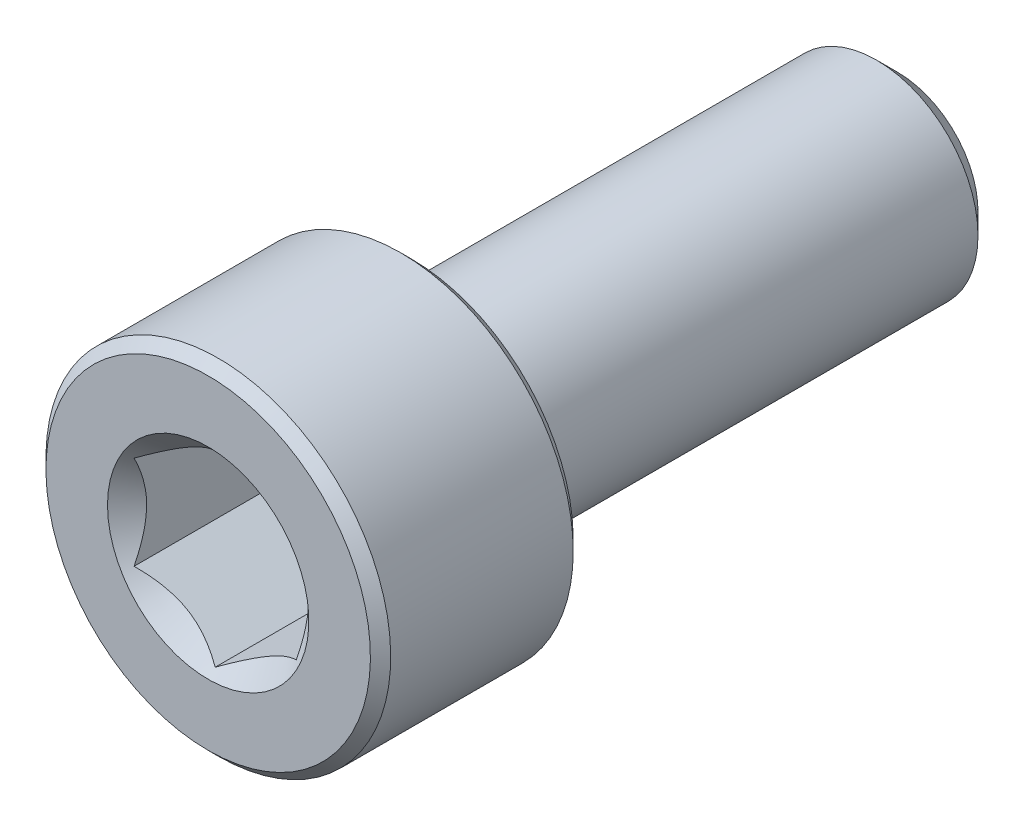
ISO-10303-21;
HEADER;
FILE_DESCRIPTION(('STEP AP214'),'2;1');
FILE_NAME('part.step','',(''),(''),'','','');
FILE_SCHEMA(('AUTOMOTIVE_DESIGN { 1 0 10303 214 1 1 1 1 }'));
ENDSEC;
DATA;
#1=APPLICATION_CONTEXT('core data for automotive mechanical design processes');
#2=APPLICATION_PROTOCOL_DEFINITION('international standard','automotive_design',2000,#1);
#3=PRODUCT_CONTEXT('',#1,'mechanical');
#4=PRODUCT('Part','Part','',(#3));
#5=PRODUCT_RELATED_PRODUCT_CATEGORY('part','',(#4));
#6=PRODUCT_DEFINITION_FORMATION('','',#4);
#7=PRODUCT_DEFINITION_CONTEXT('part definition',#1,'design');
#8=PRODUCT_DEFINITION('design','',#6,#7);
#9=PRODUCT_DEFINITION_SHAPE('','',#8);
#10=(LENGTH_UNIT() NAMED_UNIT(*) SI_UNIT(.MILLI.,.METRE.));
#11=(NAMED_UNIT(*) PLANE_ANGLE_UNIT() SI_UNIT($,.RADIAN.));
#12=(NAMED_UNIT(*) SI_UNIT($,.STERADIAN.) SOLID_ANGLE_UNIT());
#13=UNCERTAINTY_MEASURE_WITH_UNIT(LENGTH_MEASURE(1.E-05),#10,'distance_accuracy_value','');
#14=(GEOMETRIC_REPRESENTATION_CONTEXT(3) GLOBAL_UNCERTAINTY_ASSIGNED_CONTEXT((#13)) GLOBAL_UNIT_ASSIGNED_CONTEXT((#10,
#11,#12)) REPRESENTATION_CONTEXT('',''));
#15=CARTESIAN_POINT('',(0.,0.,0.));
#16=DIRECTION('',(0.,0.,1.));
#17=DIRECTION('',(1.,0.,0.));
#18=AXIS2_PLACEMENT_3D('',#15,#16,#17);
#19=CARTESIAN_POINT('',(2.,-1.15470053837925,-2.61010092660779));
#20=DIRECTION('',(1.,0.,0.));
#21=DIRECTION('',(0.,1.,0.));
#22=AXIS2_PLACEMENT_3D('',#19,#20,#21);
#23=PLANE('',#22);
#24=DIRECTION('',(0.,0.,1.));
#25=VECTOR('',#24,1.);
#26=CARTESIAN_POINT('',(2.,-1.15470053837925,-2.61010092660779));
#27=LINE('',#26,#25);
#28=CARTESIAN_POINT('',(2.,-1.15470053837925,4.5));
#29=VERTEX_POINT('',#28);
#30=CARTESIAN_POINT('',(2.,-1.15470053837925,8.32679491924311));
#31=VERTEX_POINT('',#30);
#32=EDGE_CURVE('E155',#29,#31,#27,.T.);
#33=ORIENTED_EDGE('',*,*,#32,.T.);
#34=CARTESIAN_POINT('',(2.,-1.15470053841184,8.32679491925941));
#35=CARTESIAN_POINT('',(2.,-1.2222112211191E-11,7.74944465004738));
#36=CARTESIAN_POINT('',(2.,1.15470053837925,8.3267949192431));
#37=(BOUNDED_CURVE() B_SPLINE_CURVE(2,(#34,#35,#36),.UNSPECIFIED.,.F.,
.F.) B_SPLINE_CURVE_WITH_KNOTS((3,3),(-0.486933326000508,-0.155769300936608),
.UNSPECIFIED.) CURVE() GEOMETRIC_REPRESENTATION_ITEM() RATIONAL_B_SPLINE_CURVE((1.27224318642874,
1.46905989232656,1.27224318643355)) REPRESENTATION_ITEM(''));
#38=CARTESIAN_POINT('',(2.,1.15470053837925,8.32679491924311));
#39=VERTEX_POINT('',#38);
#40=EDGE_CURVE('E120',#31,#39,#37,.T.);
#41=ORIENTED_EDGE('',*,*,#40,.T.);
#42=DIRECTION('',(0.,0.,1.));
#43=VECTOR('',#42,1.);
#44=CARTESIAN_POINT('',(2.,1.15470053837925,-2.61010092660779));
#45=LINE('',#44,#43);
#46=CARTESIAN_POINT('',(2.,1.15470053837925,4.5));
#47=VERTEX_POINT('',#46);
#48=EDGE_CURVE('E11',#47,#39,#45,.T.);
#49=ORIENTED_EDGE('',*,*,#48,.F.);
#50=DIRECTION('',(0.,1.,0.));
#51=VECTOR('',#50,1.);
#52=CARTESIAN_POINT('',(2.,-1.15470053837925,4.5));
#53=LINE('',#52,#51);
#54=EDGE_CURVE('E116',#29,#47,#53,.T.);
#55=ORIENTED_EDGE('',*,*,#54,.F.);
#56=EDGE_LOOP('',(#33,#41,#49,#55));
#57=FACE_BOUND('',#56,.T.);
#58=ADVANCED_FACE('F17',(#57),#23,.F.);
#59=CARTESIAN_POINT('',(2.,1.15470053837925,-2.61010092660779));
#60=DIRECTION('',(0.5,0.866025403784439,0.));
#61=DIRECTION('',(0.,0.,-1.));
#62=AXIS2_PLACEMENT_3D('',#59,#60,#61);
#63=PLANE('',#62);
#64=ORIENTED_EDGE('',*,*,#48,.T.);
#65=CARTESIAN_POINT('',(2.00000000002823,1.15470053836295,8.32679491925941));
#66=CARTESIAN_POINT('',(1.00000000001058,1.73205080756277,7.74944465004738));
#67=CARTESIAN_POINT('',(0.,2.3094010767585,8.3267949192431));
#68=(BOUNDED_CURVE() B_SPLINE_CURVE(2,(#65,#66,#67),.UNSPECIFIED.,.F.,
.F.) B_SPLINE_CURVE_WITH_KNOTS((3,3),(-0.486933326000508,-0.155769300936608),
.UNSPECIFIED.) CURVE() GEOMETRIC_REPRESENTATION_ITEM() RATIONAL_B_SPLINE_CURVE((1.27224318642874,
1.46905989232656,1.27224318643355)) REPRESENTATION_ITEM(''));
#69=CARTESIAN_POINT('',(0.,2.3094010767585,8.32679491924311));
#70=VERTEX_POINT('',#69);
#71=EDGE_CURVE('E233',#39,#70,#68,.T.);
#72=ORIENTED_EDGE('',*,*,#71,.T.);
#73=DIRECTION('',(0.,0.,1.));
#74=VECTOR('',#73,1.);
#75=CARTESIAN_POINT('',(0.,2.3094010767585,-2.61010092660779));
#76=LINE('',#75,#74);
#77=CARTESIAN_POINT('',(0.,2.3094010767585,4.5));
#78=VERTEX_POINT('',#77);
#79=EDGE_CURVE('E25',#78,#70,#76,.T.);
#80=ORIENTED_EDGE('',*,*,#79,.F.);
#81=DIRECTION('',(-0.866025403784439,0.5,0.));
#82=VECTOR('',#81,1.);
#83=CARTESIAN_POINT('',(2.,1.15470053837925,4.5));
#84=LINE('',#83,#82);
#85=EDGE_CURVE('E125',#47,#78,#84,.T.);
#86=ORIENTED_EDGE('',*,*,#85,.F.);
#87=EDGE_LOOP('',(#64,#72,#80,#86));
#88=FACE_BOUND('',#87,.T.);
#89=ADVANCED_FACE('F126',(#88),#63,.F.);
#90=CARTESIAN_POINT('',(0.,2.3094010767585,-2.61010092660779));
#91=DIRECTION('',(-0.5,0.866025403784439,0.));
#92=DIRECTION('',(0.,0.,1.));
#93=AXIS2_PLACEMENT_3D('',#90,#91,#92);
#94=PLANE('',#93);
#95=ORIENTED_EDGE('',*,*,#79,.T.);
#96=CARTESIAN_POINT('',(2.82244682130767E-11,2.3094010767748,8.32679491925941));
#97=CARTESIAN_POINT('',(-0.999999999989415,1.73205080757499,7.74944465004738));
#98=CARTESIAN_POINT('',(-2.,1.15470053837925,8.3267949192431));
#99=(BOUNDED_CURVE() B_SPLINE_CURVE(2,(#96,#97,#98),.UNSPECIFIED.,.F.,
.F.) B_SPLINE_CURVE_WITH_KNOTS((3,3),(-0.486933326000508,-0.155769300936609),
.UNSPECIFIED.) CURVE() GEOMETRIC_REPRESENTATION_ITEM() RATIONAL_B_SPLINE_CURVE((1.27224318642874,
1.46905989232656,1.27224318643355)) REPRESENTATION_ITEM(''));
#100=CARTESIAN_POINT('',(-2.,1.15470053837925,8.32679491924311));
#101=VERTEX_POINT('',#100);
#102=EDGE_CURVE('E239',#70,#101,#99,.T.);
#103=ORIENTED_EDGE('',*,*,#102,.T.);
#104=DIRECTION('',(0.,0.,1.));
#105=VECTOR('',#104,1.);
#106=CARTESIAN_POINT('',(-2.,1.15470053837925,-2.61010092660779));
#107=LINE('',#106,#105);
#108=CARTESIAN_POINT('',(-2.,1.15470053837925,4.5));
#109=VERTEX_POINT('',#108);
#110=EDGE_CURVE('E50',#109,#101,#107,.T.);
#111=ORIENTED_EDGE('',*,*,#110,.F.);
#112=DIRECTION('',(-0.866025403784439,-0.5,0.));
#113=VECTOR('',#112,1.);
#114=CARTESIAN_POINT('',(0.,2.3094010767585,4.5));
#115=LINE('',#114,#113);
#116=EDGE_CURVE('E130',#78,#109,#115,.T.);
#117=ORIENTED_EDGE('',*,*,#116,.F.);
#118=EDGE_LOOP('',(#95,#103,#111,#117));
#119=FACE_BOUND('',#118,.T.);
#120=ADVANCED_FACE('F261',(#119),#94,.F.);
#121=CARTESIAN_POINT('',(-2.,1.15470053837925,-2.61010092660779));
#122=DIRECTION('',(-1.,0.,0.));
#123=DIRECTION('',(0.,0.,1.));
#124=AXIS2_PLACEMENT_3D('',#121,#122,#123);
#125=PLANE('',#124);
#126=ORIENTED_EDGE('',*,*,#110,.T.);
#127=CARTESIAN_POINT('',(-2.,1.15470053841184,8.32679491925941));
#128=CARTESIAN_POINT('',(-2.,0.535898384875343,8.0173938424846));
#129=CARTESIAN_POINT('',(-2.,0.,8.0173938424846));
#130=(BOUNDED_CURVE() B_SPLINE_CURVE(2,(#127,#128,#129),.UNSPECIFIED.,.F.,
.F.) B_SPLINE_CURVE_WITH_KNOTS((3,3),(-0.486933326000508,-0.321351313466534),
.UNSPECIFIED.) CURVE() GEOMETRIC_REPRESENTATION_ITEM() RATIONAL_B_SPLINE_CURVE((1.27224318642874,
1.37065153937885,1.37065153937885)) REPRESENTATION_ITEM(''));
#131=CARTESIAN_POINT('',(-2.,0.,8.01739384248461));
#132=VERTEX_POINT('',#131);
#133=EDGE_CURVE('E245',#101,#132,#130,.T.);
#134=ORIENTED_EDGE('',*,*,#133,.T.);
#135=CARTESIAN_POINT('',(-2.,0.,8.0173938424846));
#136=CARTESIAN_POINT('',(-2.,-0.535898384862247,8.0173938424846));
#137=CARTESIAN_POINT('',(-2.,-1.15470053837925,8.3267949192431));
#138=(BOUNDED_CURVE() B_SPLINE_CURVE(2,(#135,#136,#137),.UNSPECIFIED.,.F.,
.F.) B_SPLINE_CURVE_WITH_KNOTS((3,3),(-0.321351313466534,-0.155769300936608),
.UNSPECIFIED.) CURVE() GEOMETRIC_REPRESENTATION_ITEM() RATIONAL_B_SPLINE_CURVE((1.37065153937885,
1.37065153937885,1.27224318643355)) REPRESENTATION_ITEM(''));
#139=CARTESIAN_POINT('',(-2.,-1.15470053837925,8.32679491924311));
#140=VERTEX_POINT('',#139);
#141=EDGE_CURVE('E219',#132,#140,#138,.T.);
#142=ORIENTED_EDGE('',*,*,#141,.T.);
#143=DIRECTION('',(0.,0.,1.));
#144=VECTOR('',#143,1.);
#145=CARTESIAN_POINT('',(-2.,-1.15470053837925,-2.61010092660779));
#146=LINE('',#145,#144);
#147=CARTESIAN_POINT('',(-2.,-1.15470053837925,4.5));
#148=VERTEX_POINT('',#147);
#149=EDGE_CURVE('E37',#148,#140,#146,.T.);
#150=ORIENTED_EDGE('',*,*,#149,.F.);
#151=DIRECTION('',(0.,-1.,0.));
#152=VECTOR('',#151,1.);
#153=CARTESIAN_POINT('',(-2.,1.15470053837925,4.5));
#154=LINE('',#153,#152);
#155=EDGE_CURVE('E147',#109,#148,#154,.T.);
#156=ORIENTED_EDGE('',*,*,#155,.F.);
#157=EDGE_LOOP('',(#126,#134,#142,#150,#156));
#158=FACE_BOUND('',#157,.T.);
#159=ADVANCED_FACE('F263',(#158),#125,.F.);
#160=CARTESIAN_POINT('',(-2.,-1.15470053837925,-2.61010092660779));
#161=DIRECTION('',(-0.5,-0.866025403784439,0.));
#162=DIRECTION('',(-0.866025403784439,0.5,0.));
#163=AXIS2_PLACEMENT_3D('',#160,#161,#162);
#164=PLANE('',#163);
#165=ORIENTED_EDGE('',*,*,#149,.T.);
#166=CARTESIAN_POINT('',(-2.00000000002823,-1.15470053836296,8.32679491925941));
#167=CARTESIAN_POINT('',(-1.00000000001058,-1.73205080756277,7.74944465004738));
#168=CARTESIAN_POINT('',(0.,-2.3094010767585,8.3267949192431));
#169=(BOUNDED_CURVE() B_SPLINE_CURVE(2,(#166,#167,#168),.UNSPECIFIED.,.F.,
.F.) B_SPLINE_CURVE_WITH_KNOTS((3,3),(-0.486933326000508,-0.155769300936608),
.UNSPECIFIED.) CURVE() GEOMETRIC_REPRESENTATION_ITEM() RATIONAL_B_SPLINE_CURVE((1.27224318642874,
1.46905989232656,1.27224318643355)) REPRESENTATION_ITEM(''));
#170=CARTESIAN_POINT('',(0.,-2.3094010767585,8.32679491924311));
#171=VERTEX_POINT('',#170);
#172=EDGE_CURVE('E342',#140,#171,#169,.T.);
#173=ORIENTED_EDGE('',*,*,#172,.T.);
#174=DIRECTION('',(0.,0.,1.));
#175=VECTOR('',#174,1.);
#176=CARTESIAN_POINT('',(0.,-2.3094010767585,-2.61010092660779));
#177=LINE('',#176,#175);
#178=CARTESIAN_POINT('',(0.,-2.3094010767585,4.5));
#179=VERTEX_POINT('',#178);
#180=EDGE_CURVE('E154',#179,#171,#177,.T.);
#181=ORIENTED_EDGE('',*,*,#180,.F.);
#182=DIRECTION('',(0.866025403784439,-0.5,0.));
#183=VECTOR('',#182,1.);
#184=CARTESIAN_POINT('',(-2.,-1.15470053837925,4.5));
#185=LINE('',#184,#183);
#186=EDGE_CURVE('E151',#148,#179,#185,.T.);
#187=ORIENTED_EDGE('',*,*,#186,.F.);
#188=EDGE_LOOP('',(#165,#173,#181,#187));
#189=FACE_BOUND('',#188,.T.);
#190=ADVANCED_FACE('F270',(#189),#164,.F.);
#191=CARTESIAN_POINT('',(0.,-2.3094010767585,-2.61010092660779));
#192=DIRECTION('',(0.5,-0.866025403784439,0.));
#193=DIRECTION('',(0.,0.,-1.));
#194=AXIS2_PLACEMENT_3D('',#191,#192,#193);
#195=PLANE('',#194);
#196=ORIENTED_EDGE('',*,*,#180,.T.);
#197=CARTESIAN_POINT('',(-2.82257771880862E-11,-2.3094010767748,8.3267949192594));
#198=CARTESIAN_POINT('',(0.999999999989416,-1.73205080757499,7.74944465004738));
#199=CARTESIAN_POINT('',(2.,-1.15470053837925,8.3267949192431));
#200=(BOUNDED_CURVE() B_SPLINE_CURVE(2,(#197,#198,#199),.UNSPECIFIED.,.F.,
.F.) B_SPLINE_CURVE_WITH_KNOTS((3,3),(-0.486933326000508,-0.155769300936609),
.UNSPECIFIED.) CURVE() GEOMETRIC_REPRESENTATION_ITEM() RATIONAL_B_SPLINE_CURVE((1.27224318642873,
1.46905989232655,1.27224318643355)) REPRESENTATION_ITEM(''));
#201=EDGE_CURVE('E351',#171,#31,#200,.T.);
#202=ORIENTED_EDGE('',*,*,#201,.T.);
#203=ORIENTED_EDGE('',*,*,#32,.F.);
#204=DIRECTION('',(0.866025403784439,0.5,0.));
#205=VECTOR('',#204,1.);
#206=CARTESIAN_POINT('',(0.,-2.3094010767585,4.5));
#207=LINE('',#206,#205);
#208=EDGE_CURVE('E135',#179,#29,#207,.T.);
#209=ORIENTED_EDGE('',*,*,#208,.F.);
#210=EDGE_LOOP('',(#196,#202,#203,#209));
#211=FACE_BOUND('',#210,.T.);
#212=ADVANCED_FACE('F389',(#211),#195,.F.);
#213=CARTESIAN_POINT('',(0.,4.,4.5));
#214=DIRECTION('',(0.,0.,-1.));
#215=DIRECTION('',(-1.,0.,0.));
#216=AXIS2_PLACEMENT_3D('',#213,#214,#215);
#217=PLANE('',#216);
#218=ORIENTED_EDGE('',*,*,#208,.T.);
#219=ORIENTED_EDGE('',*,*,#54,.T.);
#220=ORIENTED_EDGE('',*,*,#85,.T.);
#221=ORIENTED_EDGE('',*,*,#116,.T.);
#222=ORIENTED_EDGE('',*,*,#155,.T.);
#223=ORIENTED_EDGE('',*,*,#186,.T.);
#224=EDGE_LOOP('',(#218,#219,#220,#221,#222,#223));
#225=FACE_BOUND('',#224,.T.);
#226=ADVANCED_FACE('F132',(#225),#217,.F.);
#227=CARTESIAN_POINT('',(0.,0.,8.5));
#228=DIRECTION('',(0.,0.,1.));
#229=DIRECTION('',(0.,-1.,0.));
#230=AXIS2_PLACEMENT_3D('',#227,#228,#229);
#231=PLANE('',#230);
#232=CARTESIAN_POINT('',(0.,0.,8.5));
#233=DIRECTION('',(0.,0.,1.));
#234=DIRECTION('',(1.,0.,0.));
#235=AXIS2_PLACEMENT_3D('',#232,#233,#234);
#236=CIRCLE('',#235,2.48260615751539);
#237=CARTESIAN_POINT('',(-2.48260615751539,0.,8.5));
#238=VERTEX_POINT('',#237);
#239=EDGE_CURVE('E227',#238,#238,#236,.T.);
#240=ORIENTED_EDGE('',*,*,#239,.F.);
#241=EDGE_LOOP('',(#240));
#242=FACE_BOUND('',#241,.T.);
#243=CARTESIAN_POINT('',(0.,0.,8.5));
#244=DIRECTION('',(0.,0.,-1.));
#245=DIRECTION('',(0.,1.,0.));
#246=AXIS2_PLACEMENT_3D('',#243,#244,#245);
#247=CIRCLE('',#246,4.);
#248=CARTESIAN_POINT('',(0.,-4.,8.5));
#249=VERTEX_POINT('',#248);
#250=EDGE_CURVE('E228',#249,#249,#247,.T.);
#251=ORIENTED_EDGE('',*,*,#250,.F.);
#252=EDGE_LOOP('',(#251));
#253=FACE_BOUND('',#252,.T.);
#254=ADVANCED_FACE('F393',(#242,#253),#231,.T.);
#255=CARTESIAN_POINT('',(0.,4.,3.5));
#256=DIRECTION('',(0.,0.,-1.));
#257=DIRECTION('',(-1.,0.,0.));
#258=AXIS2_PLACEMENT_3D('',#255,#256,#257);
#259=PLANE('',#258);
#260=CARTESIAN_POINT('',(0.,0.,3.5));
#261=DIRECTION('',(0.,0.,-1.));
#262=DIRECTION('',(0.,1.,0.));
#263=AXIS2_PLACEMENT_3D('',#260,#261,#262);
#264=CIRCLE('',#263,2.75);
#265=CARTESIAN_POINT('',(0.,-2.75,3.5));
#266=VERTEX_POINT('',#265);
#267=EDGE_CURVE('E190',#266,#266,#264,.T.);
#268=ORIENTED_EDGE('',*,*,#267,.F.);
#269=EDGE_LOOP('',(#268));
#270=FACE_BOUND('',#269,.T.);
#271=CARTESIAN_POINT('',(0.,0.,3.5));
#272=DIRECTION('',(0.,0.,-1.));
#273=DIRECTION('',(0.,1.,0.));
#274=AXIS2_PLACEMENT_3D('',#271,#272,#273);
#275=CIRCLE('',#274,4.);
#276=CARTESIAN_POINT('',(0.,4.,3.5));
#277=VERTEX_POINT('',#276);
#278=EDGE_CURVE('E179',#277,#277,#275,.T.);
#279=ORIENTED_EDGE('',*,*,#278,.T.);
#280=EDGE_LOOP('',(#279));
#281=FACE_BOUND('',#280,.T.);
#282=ADVANCED_FACE('F396',(#270,#281),#259,.T.);
#283=CARTESIAN_POINT('',(0.,1.98038475772934,-8.5));
#284=DIRECTION('',(0.,0.,-1.));
#285=DIRECTION('',(-1.,0.,0.));
#286=AXIS2_PLACEMENT_3D('',#283,#284,#285);
#287=PLANE('',#286);
#288=CARTESIAN_POINT('',(0.,0.,-8.5));
#289=DIRECTION('',(0.,0.,-1.));
#290=DIRECTION('',(0.,1.,0.));
#291=AXIS2_PLACEMENT_3D('',#288,#289,#290);
#292=CIRCLE('',#291,1.98038475772934);
#293=CARTESIAN_POINT('',(0.,1.98038475772934,-8.5));
#294=VERTEX_POINT('',#293);
#295=EDGE_CURVE('E142',#294,#294,#292,.T.);
#296=ORIENTED_EDGE('',*,*,#295,.T.);
#297=EDGE_LOOP('',(#296));
#298=FACE_BOUND('',#297,.T.);
#299=ADVANCED_FACE('F546',(#298),#287,.T.);
#300=CARTESIAN_POINT('',(0.,0.,-8.5));
#301=DIRECTION('',(0.,0.,1.));
#302=DIRECTION('',(0.,-1.,0.));
#303=AXIS2_PLACEMENT_3D('',#300,#301,#302);
#304=CONICAL_SURFACE('',#303,1.98038475772934,0.785398163397447);
#305=CARTESIAN_POINT('',(0.,0.,-7.98038475772934));
#306=DIRECTION('',(0.,0.,-1.));
#307=DIRECTION('',(0.,1.,0.));
#308=AXIS2_PLACEMENT_3D('',#305,#306,#307);
#309=CIRCLE('',#308,2.5);
#310=CARTESIAN_POINT('',(0.,2.5,-7.98038475772934));
#311=VERTEX_POINT('',#310);
#312=CARTESIAN_POINT('',(0.,-2.5,-7.98038475772934));
#313=VERTEX_POINT('',#312);
#314=EDGE_CURVE('E193',#311,#313,#309,.T.);
#315=ORIENTED_EDGE('',*,*,#314,.T.);
#316=CARTESIAN_POINT('',(0.,0.,-7.98038475772934));
#317=DIRECTION('',(0.,0.,-1.));
#318=DIRECTION('',(0.,1.,0.));
#319=AXIS2_PLACEMENT_3D('',#316,#317,#318);
#320=CIRCLE('',#319,2.5);
#321=EDGE_CURVE('E197',#313,#311,#320,.T.);
#322=ORIENTED_EDGE('',*,*,#321,.T.);
#323=DIRECTION('',(0.,-0.707106781186546,-0.707106781186549));
#324=VECTOR('',#323,1.);
#325=CARTESIAN_POINT('',(0.,1.98038475772934,-8.5));
#326=LINE('',#325,#324);
#327=EDGE_CURVE('E202',#311,#294,#326,.T.);
#328=ORIENTED_EDGE('',*,*,#327,.T.);
#329=ORIENTED_EDGE('',*,*,#295,.F.);
#330=ORIENTED_EDGE('',*,*,#327,.F.);
#331=EDGE_LOOP('',(#315,#322,#328,#329,#330));
#332=FACE_BOUND('',#331,.T.);
#333=ADVANCED_FACE('F538',(#332),#304,.T.);
#334=CARTESIAN_POINT('',(0.,0.,-8.5));
#335=DIRECTION('',(0.,0.,-1.));
#336=DIRECTION('',(0.,1.,0.));
#337=AXIS2_PLACEMENT_3D('',#334,#335,#336);
#338=CYLINDRICAL_SURFACE('',#337,2.5);
#339=ORIENTED_EDGE('',*,*,#314,.F.);
#340=ORIENTED_EDGE('',*,*,#321,.F.);
#341=DIRECTION('',(0.,0.,1.));
#342=VECTOR('',#341,1.);
#343=CARTESIAN_POINT('',(0.,-2.5,-8.5));
#344=LINE('',#343,#342);
#345=CARTESIAN_POINT('',(0.,-2.5,3.25));
#346=VERTEX_POINT('',#345);
#347=EDGE_CURVE('E200',#313,#346,#344,.T.);
#348=ORIENTED_EDGE('',*,*,#347,.T.);
#349=CARTESIAN_POINT('',(0.,0.,3.25));
#350=DIRECTION('',(0.,0.,-1.));
#351=DIRECTION('',(0.,1.,0.));
#352=AXIS2_PLACEMENT_3D('',#349,#350,#351);
#353=CIRCLE('',#352,2.5);
#354=EDGE_CURVE('E182',#346,#346,#353,.T.);
#355=ORIENTED_EDGE('',*,*,#354,.T.);
#356=ORIENTED_EDGE('',*,*,#347,.F.);
#357=EDGE_LOOP('',(#339,#340,#348,#355,#356));
#358=FACE_BOUND('',#357,.T.);
#359=ADVANCED_FACE('F523',(#358),#338,.T.);
#360=CARTESIAN_POINT('',(0.,0.,3.25));
#361=DIRECTION('',(0.,0.,-1.));
#362=DIRECTION('',(0.,1.,0.));
#363=AXIS2_PLACEMENT_3D('',#360,#361,#362);
#364=TOROIDAL_SURFACE('',#363,2.75,0.25);
#365=ORIENTED_EDGE('',*,*,#354,.F.);
#366=CARTESIAN_POINT('',(0.,-2.75,3.25));
#367=DIRECTION('',(1.,0.,0.));
#368=DIRECTION('',(0.,-1.,0.));
#369=AXIS2_PLACEMENT_3D('',#366,#367,#368);
#370=CIRCLE('',#369,0.25);
#371=EDGE_CURVE('E186',#346,#266,#370,.T.);
#372=ORIENTED_EDGE('',*,*,#371,.T.);
#373=ORIENTED_EDGE('',*,*,#267,.T.);
#374=ORIENTED_EDGE('',*,*,#371,.F.);
#375=EDGE_LOOP('',(#365,#372,#373,#374));
#376=FACE_BOUND('',#375,.T.);
#377=ADVANCED_FACE('F518',(#376),#364,.F.);
#378=CARTESIAN_POINT('',(0.,0.,3.5));
#379=DIRECTION('',(0.,0.,1.));
#380=DIRECTION('',(0.,-1.,0.));
#381=AXIS2_PLACEMENT_3D('',#378,#379,#380);
#382=CONICAL_SURFACE('',#381,4.,0.785398163397448);
#383=CARTESIAN_POINT('',(0.,0.,3.75));
#384=DIRECTION('',(0.,0.,-1.));
#385=DIRECTION('',(0.,1.,0.));
#386=AXIS2_PLACEMENT_3D('',#383,#384,#385);
#387=CIRCLE('',#386,4.25);
#388=CARTESIAN_POINT('',(0.,4.25,3.75));
#389=VERTEX_POINT('',#388);
#390=CARTESIAN_POINT('',(0.,-4.25,3.75));
#391=VERTEX_POINT('',#390);
#392=EDGE_CURVE('E169',#389,#391,#387,.T.);
#393=ORIENTED_EDGE('',*,*,#392,.T.);
#394=CARTESIAN_POINT('',(0.,0.,3.75));
#395=DIRECTION('',(0.,0.,-1.));
#396=DIRECTION('',(0.,1.,0.));
#397=AXIS2_PLACEMENT_3D('',#394,#395,#396);
#398=CIRCLE('',#397,4.25);
#399=EDGE_CURVE('E175',#391,#389,#398,.T.);
#400=ORIENTED_EDGE('',*,*,#399,.T.);
#401=DIRECTION('',(0.,-0.707106781186548,-0.707106781186548));
#402=VECTOR('',#401,1.);
#403=CARTESIAN_POINT('',(0.,4.,3.5));
#404=LINE('',#403,#402);
#405=EDGE_CURVE('E174',#389,#277,#404,.T.);
#406=ORIENTED_EDGE('',*,*,#405,.T.);
#407=ORIENTED_EDGE('',*,*,#278,.F.);
#408=ORIENTED_EDGE('',*,*,#405,.F.);
#409=EDGE_LOOP('',(#393,#400,#406,#407,#408));
#410=FACE_BOUND('',#409,.T.);
#411=ADVANCED_FACE('F409',(#410),#382,.T.);
#412=CARTESIAN_POINT('',(0.,0.,-8.5));
#413=DIRECTION('',(0.,0.,-1.));
#414=DIRECTION('',(0.,1.,0.));
#415=AXIS2_PLACEMENT_3D('',#412,#413,#414);
#416=CYLINDRICAL_SURFACE('',#415,4.25);
#417=ORIENTED_EDGE('',*,*,#392,.F.);
#418=ORIENTED_EDGE('',*,*,#399,.F.);
#419=DIRECTION('',(0.,0.,1.));
#420=VECTOR('',#419,1.);
#421=CARTESIAN_POINT('',(0.,-4.25,-8.5));
#422=LINE('',#421,#420);
#423=CARTESIAN_POINT('',(0.,-4.25,8.25));
#424=VERTEX_POINT('',#423);
#425=EDGE_CURVE('E171',#391,#424,#422,.T.);
#426=ORIENTED_EDGE('',*,*,#425,.T.);
#427=CARTESIAN_POINT('',(0.,0.,8.25));
#428=DIRECTION('',(0.,0.,-1.));
#429=DIRECTION('',(0.,1.,0.));
#430=AXIS2_PLACEMENT_3D('',#427,#428,#429);
#431=CIRCLE('',#430,4.25);
#432=EDGE_CURVE('E238',#424,#424,#431,.T.);
#433=ORIENTED_EDGE('',*,*,#432,.T.);
#434=ORIENTED_EDGE('',*,*,#425,.F.);
#435=EDGE_LOOP('',(#417,#418,#426,#433,#434));
#436=FACE_BOUND('',#435,.T.);
#437=ADVANCED_FACE('F405',(#436),#416,.T.);
#438=CARTESIAN_POINT('',(0.,0.,8.25));
#439=DIRECTION('',(0.,0.,-1.));
#440=DIRECTION('',(0.,1.,0.));
#441=AXIS2_PLACEMENT_3D('',#438,#439,#440);
#442=CONICAL_SURFACE('',#441,4.25,0.785398163397448);
#443=ORIENTED_EDGE('',*,*,#432,.F.);
#444=DIRECTION('',(0.,0.707106781186548,0.707106781186548));
#445=VECTOR('',#444,1.);
#446=CARTESIAN_POINT('',(0.,-4.25,8.25));
#447=LINE('',#446,#445);
#448=EDGE_CURVE('E232',#424,#249,#447,.T.);
#449=ORIENTED_EDGE('',*,*,#448,.T.);
#450=ORIENTED_EDGE('',*,*,#250,.T.);
#451=ORIENTED_EDGE('',*,*,#448,.F.);
#452=EDGE_LOOP('',(#443,#449,#450,#451));
#453=FACE_BOUND('',#452,.T.);
#454=ADVANCED_FACE('F402',(#453),#442,.T.);
#455=CARTESIAN_POINT('',(0.,0.,8.5));
#456=DIRECTION('',(0.,0.,1.));
#457=DIRECTION('',(1.,0.,0.));
#458=AXIS2_PLACEMENT_3D('',#455,#456,#457);
#459=CONICAL_SURFACE('',#458,2.48260615751539,0.78539816339745);
#460=ORIENTED_EDGE('',*,*,#40,.F.);
#461=ORIENTED_EDGE('',*,*,#201,.F.);
#462=ORIENTED_EDGE('',*,*,#172,.F.);
#463=ORIENTED_EDGE('',*,*,#141,.F.);
#464=DIRECTION('',(-0.707106781186549,0.,0.707106781186546));
#465=VECTOR('',#464,1.);
#466=CARTESIAN_POINT('',(-2.48260615751539,0.,8.5));
#467=LINE('',#466,#465);
#468=EDGE_CURVE('E223',#132,#238,#467,.T.);
#469=ORIENTED_EDGE('',*,*,#468,.T.);
#470=ORIENTED_EDGE('',*,*,#239,.T.);
#471=ORIENTED_EDGE('',*,*,#468,.F.);
#472=ORIENTED_EDGE('',*,*,#133,.F.);
#473=ORIENTED_EDGE('',*,*,#102,.F.);
#474=ORIENTED_EDGE('',*,*,#71,.F.);
#475=EDGE_LOOP('',(#460,#461,#462,#463,#469,#470,#471,#472,#473,#474));
#476=FACE_BOUND('',#475,.T.);
#477=ADVANCED_FACE('F349',(#476),#459,.F.);
#478=CLOSED_SHELL('',(#58,#89,#120,#159,#190,#212,#226,#254,#282,#299,#333,#359,#377,#411,#437,
#454,#477));
#479=MANIFOLD_SOLID_BREP('B1',#478);
#480=ADVANCED_BREP_SHAPE_REPRESENTATION('',(#18,#479),#14);
#481=SHAPE_DEFINITION_REPRESENTATION(#9,#480);
ENDSEC;
END-ISO-10303-21;
